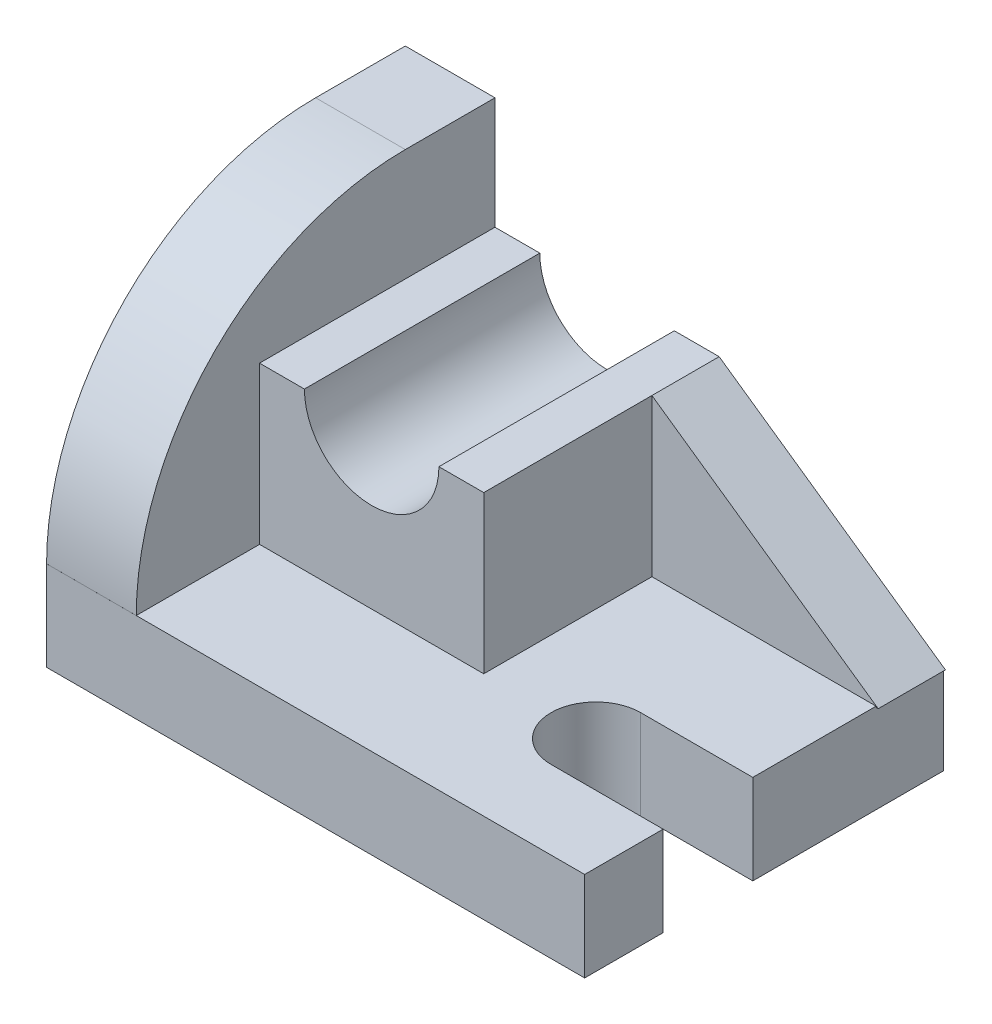
ISO-10303-21;
HEADER;
FILE_DESCRIPTION(('STEP AP214'),'2;1');
FILE_NAME('part.step','',(''),(''),'','','');
FILE_SCHEMA(('AUTOMOTIVE_DESIGN { 1 0 10303 214 1 1 1 1 }'));
ENDSEC;
DATA;
#1=APPLICATION_CONTEXT('core data for automotive mechanical design processes');
#2=APPLICATION_PROTOCOL_DEFINITION('international standard','automotive_design',2000,#1);
#3=PRODUCT_CONTEXT('',#1,'mechanical');
#4=PRODUCT('Part','Part','',(#3));
#5=PRODUCT_RELATED_PRODUCT_CATEGORY('part','',(#4));
#6=PRODUCT_DEFINITION_FORMATION('','',#4);
#7=PRODUCT_DEFINITION_CONTEXT('part definition',#1,'design');
#8=PRODUCT_DEFINITION('design','',#6,#7);
#9=PRODUCT_DEFINITION_SHAPE('','',#8);
#10=(LENGTH_UNIT() NAMED_UNIT(*) SI_UNIT(.MILLI.,.METRE.));
#11=(NAMED_UNIT(*) PLANE_ANGLE_UNIT() SI_UNIT($,.RADIAN.));
#12=(NAMED_UNIT(*) SI_UNIT($,.STERADIAN.) SOLID_ANGLE_UNIT());
#13=UNCERTAINTY_MEASURE_WITH_UNIT(LENGTH_MEASURE(1.E-05),#10,'distance_accuracy_value','');
#14=(GEOMETRIC_REPRESENTATION_CONTEXT(3) GLOBAL_UNCERTAINTY_ASSIGNED_CONTEXT((#13)) GLOBAL_UNIT_ASSIGNED_CONTEXT((#10,
#11,#12)) REPRESENTATION_CONTEXT('',''));
#15=CARTESIAN_POINT('',(0.,0.,0.));
#16=DIRECTION('',(0.,0.,1.));
#17=DIRECTION('',(1.,0.,0.));
#18=AXIS2_PLACEMENT_3D('',#15,#16,#17);
#19=CARTESIAN_POINT('',(48.,16.,-32.));
#20=DIRECTION('',(-1.,0.,0.));
#21=DIRECTION('',(0.,0.,1.));
#22=AXIS2_PLACEMENT_3D('',#19,#20,#21);
#23=PLANE('',#22);
#24=DIRECTION('',(0.,0.,-1.));
#25=VECTOR('',#24,1.);
#26=CARTESIAN_POINT('',(48.,0.,-32.));
#27=LINE('',#26,#25);
#28=CARTESIAN_POINT('',(48.,0.,32.));
#29=VERTEX_POINT('',#28);
#30=CARTESIAN_POINT('',(48.,0.,18.));
#31=VERTEX_POINT('',#30);
#32=EDGE_CURVE('E283',#29,#31,#27,.T.);
#33=ORIENTED_EDGE('',*,*,#32,.T.);
#34=DIRECTION('',(0.,1.,0.));
#35=VECTOR('',#34,1.);
#36=CARTESIAN_POINT('',(48.,0.,18.));
#37=LINE('',#36,#35);
#38=CARTESIAN_POINT('',(48.,16.,18.));
#39=VERTEX_POINT('',#38);
#40=EDGE_CURVE('E265',#31,#39,#37,.T.);
#41=ORIENTED_EDGE('',*,*,#40,.T.);
#42=DIRECTION('',(0.,0.,-1.));
#43=VECTOR('',#42,1.);
#44=CARTESIAN_POINT('',(48.,16.,-32.));
#45=LINE('',#44,#43);
#46=CARTESIAN_POINT('',(48.,16.,32.));
#47=VERTEX_POINT('',#46);
#48=EDGE_CURVE('E274',#47,#39,#45,.T.);
#49=ORIENTED_EDGE('',*,*,#48,.F.);
#50=DIRECTION('',(0.,-1.,0.));
#51=VECTOR('',#50,1.);
#52=CARTESIAN_POINT('',(48.,16.,32.));
#53=LINE('',#52,#51);
#54=EDGE_CURVE('E282',#47,#29,#53,.T.);
#55=ORIENTED_EDGE('',*,*,#54,.T.);
#56=EDGE_LOOP('',(#33,#41,#49,#55));
#57=FACE_BOUND('',#56,.T.);
#58=ADVANCED_FACE('F32',(#57),#23,.F.);
#59=DIRECTION('',(0.,-1.,0.));
#60=VECTOR('',#59,1.);
#61=CARTESIAN_POINT('',(48.,16.,-32.));
#62=LINE('',#61,#60);
#63=CARTESIAN_POINT('',(48.,15.7939448032513,-32.));
#64=VERTEX_POINT('',#63);
#65=CARTESIAN_POINT('',(48.,0.,-32.));
#66=VERTEX_POINT('',#65);
#67=EDGE_CURVE('E11',#64,#66,#62,.T.);
#68=ORIENTED_EDGE('',*,*,#67,.F.);
#69=DIRECTION('',(0.,0.,1.));
#70=VECTOR('',#69,1.);
#71=CARTESIAN_POINT('',(48.,15.7939448032513,-32.));
#72=LINE('',#71,#70);
#73=CARTESIAN_POINT('',(48.,15.7939448032513,-20.));
#74=VERTEX_POINT('',#73);
#75=EDGE_CURVE('E47',#64,#74,#72,.T.);
#76=ORIENTED_EDGE('',*,*,#75,.T.);
#77=DIRECTION('',(0.,1.,0.));
#78=VECTOR('',#77,1.);
#79=CARTESIAN_POINT('',(48.,16.,-20.));
#80=LINE('',#79,#78);
#81=CARTESIAN_POINT('',(48.,16.,-20.));
#82=VERTEX_POINT('',#81);
#83=EDGE_CURVE('E179',#74,#82,#80,.T.);
#84=ORIENTED_EDGE('',*,*,#83,.T.);
#85=CARTESIAN_POINT('',(48.,16.,1.99999999999999));
#86=VERTEX_POINT('',#85);
#87=EDGE_CURVE('E278',#86,#82,#45,.T.);
#88=ORIENTED_EDGE('',*,*,#87,.F.);
#89=DIRECTION('',(0.,1.,0.));
#90=VECTOR('',#89,1.);
#91=CARTESIAN_POINT('',(48.,0.,1.99999999999999));
#92=LINE('',#91,#90);
#93=CARTESIAN_POINT('',(48.,0.,1.99999999999999));
#94=VERTEX_POINT('',#93);
#95=EDGE_CURVE('E258',#94,#86,#92,.T.);
#96=ORIENTED_EDGE('',*,*,#95,.F.);
#97=EDGE_CURVE('E268',#94,#66,#27,.T.);
#98=ORIENTED_EDGE('',*,*,#97,.T.);
#99=EDGE_LOOP('',(#68,#76,#84,#88,#96,#98));
#100=FACE_BOUND('',#99,.T.);
#101=ADVANCED_FACE('F34',(#100),#23,.F.);
#102=CARTESIAN_POINT('',(-48.,16.,-32.));
#103=DIRECTION('',(0.,0.,1.));
#104=DIRECTION('',(1.,0.,0.));
#105=AXIS2_PLACEMENT_3D('',#102,#103,#104);
#106=PLANE('',#105);
#107=DIRECTION('',(-0.999986731906535,0.00515131156972607,0.));
#108=VECTOR('',#107,1.);
#109=CARTESIAN_POINT('',(48.3682100291097,15.7920480135015,-32.));
#110=LINE('',#109,#108);
#111=CARTESIAN_POINT('',(48.3682100291097,15.7920480135015,-32.));
#112=VERTEX_POINT('',#111);
#113=EDGE_CURVE('E162',#112,#64,#110,.T.);
#114=ORIENTED_EDGE('',*,*,#113,.T.);
#115=ORIENTED_EDGE('',*,*,#67,.T.);
#116=DIRECTION('',(-1.,0.,0.));
#117=VECTOR('',#116,1.);
#118=CARTESIAN_POINT('',(-48.,0.,-32.));
#119=LINE('',#118,#117);
#120=CARTESIAN_POINT('',(-48.,0.,-32.));
#121=VERTEX_POINT('',#120);
#122=EDGE_CURVE('E286',#66,#121,#119,.T.);
#123=ORIENTED_EDGE('',*,*,#122,.T.);
#124=DIRECTION('',(0.,-1.,0.));
#125=VECTOR('',#124,1.);
#126=CARTESIAN_POINT('',(-48.,16.,-32.));
#127=LINE('',#126,#125);
#128=CARTESIAN_POINT('',(-48.,64.,-32.));
#129=VERTEX_POINT('',#128);
#130=EDGE_CURVE('E40',#129,#121,#127,.T.);
#131=ORIENTED_EDGE('',*,*,#130,.F.);
#132=DIRECTION('',(-1.,0.,0.));
#133=VECTOR('',#132,1.);
#134=CARTESIAN_POINT('',(-32.,64.,-32.));
#135=LINE('',#134,#133);
#136=CARTESIAN_POINT('',(-32.,64.,-32.));
#137=VERTEX_POINT('',#136);
#138=EDGE_CURVE('E205',#137,#129,#135,.T.);
#139=ORIENTED_EDGE('',*,*,#138,.F.);
#140=DIRECTION('',(0.,-1.,0.));
#141=VECTOR('',#140,1.);
#142=CARTESIAN_POINT('',(-32.,0.,-32.));
#143=LINE('',#142,#141);
#144=CARTESIAN_POINT('',(-32.,44.,-32.));
#145=VERTEX_POINT('',#144);
#146=EDGE_CURVE('E190',#137,#145,#143,.T.);
#147=ORIENTED_EDGE('',*,*,#146,.T.);
#148=DIRECTION('',(1.,0.,0.));
#149=VECTOR('',#148,1.);
#150=CARTESIAN_POINT('',(0.,44.,-32.));
#151=LINE('',#150,#149);
#152=CARTESIAN_POINT('',(-24.,44.,-32.));
#153=VERTEX_POINT('',#152);
#154=EDGE_CURVE('E217',#145,#153,#151,.T.);
#155=ORIENTED_EDGE('',*,*,#154,.T.);
#156=CARTESIAN_POINT('',(-12.,44.,-32.));
#157=DIRECTION('',(0.,0.,1.));
#158=DIRECTION('',(1.,0.,0.));
#159=AXIS2_PLACEMENT_3D('',#156,#157,#158);
#160=CIRCLE('',#159,12.);
#161=CARTESIAN_POINT('',(0.,44.,-32.));
#162=VERTEX_POINT('',#161);
#163=EDGE_CURVE('E214',#153,#162,#160,.T.);
#164=ORIENTED_EDGE('',*,*,#163,.T.);
#165=CARTESIAN_POINT('',(8.,44.,-32.));
#166=VERTEX_POINT('',#165);
#167=EDGE_CURVE('E220',#162,#166,#151,.T.);
#168=ORIENTED_EDGE('',*,*,#167,.T.);
#169=DIRECTION('',(0.819706664797747,-0.572783539992338,0.));
#170=VECTOR('',#169,1.);
#171=CARTESIAN_POINT('',(8.,44.,-32.));
#172=LINE('',#171,#170);
#173=EDGE_CURVE('E183',#166,#112,#172,.T.);
#174=ORIENTED_EDGE('',*,*,#173,.T.);
#175=EDGE_LOOP('',(#114,#115,#123,#131,#139,#147,#155,#164,#168,#174));
#176=FACE_BOUND('',#175,.T.);
#177=ADVANCED_FACE('F329',(#176),#106,.F.);
#178=CARTESIAN_POINT('',(-48.,16.,-32.));
#179=DIRECTION('',(1.,0.,0.));
#180=DIRECTION('',(0.,0.,-1.));
#181=AXIS2_PLACEMENT_3D('',#178,#179,#180);
#182=PLANE('',#181);
#183=DIRECTION('',(0.,0.,1.));
#184=VECTOR('',#183,1.);
#185=CARTESIAN_POINT('',(-48.,16.,-32.));
#186=LINE('',#185,#184);
#187=CARTESIAN_POINT('',(-48.,16.,31.997051588305));
#188=VERTEX_POINT('',#187);
#189=CARTESIAN_POINT('',(-48.,16.,32.));
#190=VERTEX_POINT('',#189);
#191=EDGE_CURVE('E277',#188,#190,#186,.T.);
#192=ORIENTED_EDGE('',*,*,#191,.F.);
#193=CARTESIAN_POINT('',(-48.,16.,-16.002948411695));
#194=DIRECTION('',(-1.,0.,0.));
#195=DIRECTION('',(0.,0.,1.));
#196=AXIS2_PLACEMENT_3D('',#193,#194,#195);
#197=CIRCLE('',#196,48.);
#198=CARTESIAN_POINT('',(-48.,64.,-16.0029484116953));
#199=VERTEX_POINT('',#198);
#200=EDGE_CURVE('E189',#188,#199,#197,.T.);
#201=ORIENTED_EDGE('',*,*,#200,.T.);
#202=DIRECTION('',(0.,0.,-1.));
#203=VECTOR('',#202,1.);
#204=CARTESIAN_POINT('',(-48.,64.,-32.));
#205=LINE('',#204,#203);
#206=EDGE_CURVE('E194',#199,#129,#205,.T.);
#207=ORIENTED_EDGE('',*,*,#206,.T.);
#208=ORIENTED_EDGE('',*,*,#130,.T.);
#209=DIRECTION('',(0.,0.,1.));
#210=VECTOR('',#209,1.);
#211=CARTESIAN_POINT('',(-48.,0.,-32.));
#212=LINE('',#211,#210);
#213=CARTESIAN_POINT('',(-48.,0.,32.));
#214=VERTEX_POINT('',#213);
#215=EDGE_CURVE('E288',#121,#214,#212,.T.);
#216=ORIENTED_EDGE('',*,*,#215,.T.);
#217=DIRECTION('',(0.,-1.,0.));
#218=VECTOR('',#217,1.);
#219=CARTESIAN_POINT('',(-48.,16.,32.));
#220=LINE('',#219,#218);
#221=EDGE_CURVE('E294',#190,#214,#220,.T.);
#222=ORIENTED_EDGE('',*,*,#221,.F.);
#223=EDGE_LOOP('',(#192,#201,#207,#208,#216,#222));
#224=FACE_BOUND('',#223,.T.);
#225=ADVANCED_FACE('F300',(#224),#182,.F.);
#226=CARTESIAN_POINT('',(-48.,16.,32.));
#227=DIRECTION('',(0.,0.,-1.));
#228=DIRECTION('',(-1.,0.,0.));
#229=AXIS2_PLACEMENT_3D('',#226,#227,#228);
#230=PLANE('',#229);
#231=DIRECTION('',(1.,0.,0.));
#232=VECTOR('',#231,1.);
#233=CARTESIAN_POINT('',(-48.,0.,32.));
#234=LINE('',#233,#232);
#235=EDGE_CURVE('E290',#214,#29,#234,.T.);
#236=ORIENTED_EDGE('',*,*,#235,.T.);
#237=ORIENTED_EDGE('',*,*,#54,.F.);
#238=DIRECTION('',(1.,0.,0.));
#239=VECTOR('',#238,1.);
#240=CARTESIAN_POINT('',(-48.,16.,32.));
#241=LINE('',#240,#239);
#242=EDGE_CURVE('E280',#190,#47,#241,.T.);
#243=ORIENTED_EDGE('',*,*,#242,.F.);
#244=ORIENTED_EDGE('',*,*,#221,.T.);
#245=EDGE_LOOP('',(#236,#237,#243,#244));
#246=FACE_BOUND('',#245,.T.);
#247=ADVANCED_FACE('F312',(#246),#230,.F.);
#248=CARTESIAN_POINT('',(0.,16.,0.));
#249=DIRECTION('',(0.,1.,0.));
#250=DIRECTION('',(0.,0.,1.));
#251=AXIS2_PLACEMENT_3D('',#248,#249,#250);
#252=PLANE('',#251);
#253=DIRECTION('',(1.,0.,0.));
#254=VECTOR('',#253,1.);
#255=CARTESIAN_POINT('',(0.,16.,-20.));
#256=LINE('',#255,#254);
#257=CARTESIAN_POINT('',(8.,16.,-20.));
#258=VERTEX_POINT('',#257);
#259=EDGE_CURVE('E166',#258,#82,#256,.T.);
#260=ORIENTED_EDGE('',*,*,#259,.F.);
#261=DIRECTION('',(0.,0.,1.));
#262=VECTOR('',#261,1.);
#263=CARTESIAN_POINT('',(8.,16.,-32.));
#264=LINE('',#263,#262);
#265=CARTESIAN_POINT('',(8.,16.,9.99999999999999));
#266=VERTEX_POINT('',#265);
#267=EDGE_CURVE('E240',#258,#266,#264,.T.);
#268=ORIENTED_EDGE('',*,*,#267,.T.);
#269=DIRECTION('',(-1.,0.,0.));
#270=VECTOR('',#269,1.);
#271=CARTESIAN_POINT('',(0.,16.,9.99999999999999));
#272=LINE('',#271,#270);
#273=CARTESIAN_POINT('',(-32.,16.,9.99999999999999));
#274=VERTEX_POINT('',#273);
#275=EDGE_CURVE('E228',#266,#274,#272,.T.);
#276=ORIENTED_EDGE('',*,*,#275,.T.);
#277=DIRECTION('',(0.,0.,1.));
#278=VECTOR('',#277,1.);
#279=CARTESIAN_POINT('',(-32.,16.,0.));
#280=LINE('',#279,#278);
#281=CARTESIAN_POINT('',(-32.,16.,31.997051588305));
#282=VERTEX_POINT('',#281);
#283=EDGE_CURVE('E208',#274,#282,#280,.T.);
#284=ORIENTED_EDGE('',*,*,#283,.T.);
#285=DIRECTION('',(-1.,0.,0.));
#286=VECTOR('',#285,1.);
#287=CARTESIAN_POINT('',(-32.,15.9999999999997,31.997051588305));
#288=LINE('',#287,#286);
#289=EDGE_CURVE('E200',#282,#188,#288,.T.);
#290=ORIENTED_EDGE('',*,*,#289,.T.);
#291=ORIENTED_EDGE('',*,*,#191,.T.);
#292=ORIENTED_EDGE('',*,*,#242,.T.);
#293=ORIENTED_EDGE('',*,*,#48,.T.);
#294=DIRECTION('',(1.,0.,0.));
#295=VECTOR('',#294,1.);
#296=CARTESIAN_POINT('',(48.,16.,18.));
#297=LINE('',#296,#295);
#298=CARTESIAN_POINT('',(28.,16.,18.));
#299=VERTEX_POINT('',#298);
#300=EDGE_CURVE('E252',#299,#39,#297,.T.);
#301=ORIENTED_EDGE('',*,*,#300,.F.);
#302=CARTESIAN_POINT('',(28.,16.,9.99999999999999));
#303=DIRECTION('',(0.,1.,0.));
#304=DIRECTION('',(0.,0.,1.));
#305=AXIS2_PLACEMENT_3D('',#302,#303,#304);
#306=CIRCLE('',#305,8.);
#307=CARTESIAN_POINT('',(28.,16.,1.99999999999999));
#308=VERTEX_POINT('',#307);
#309=EDGE_CURVE('E261',#308,#299,#306,.T.);
#310=ORIENTED_EDGE('',*,*,#309,.F.);
#311=DIRECTION('',(-1.,0.,0.));
#312=VECTOR('',#311,1.);
#313=CARTESIAN_POINT('',(48.,16.,1.99999999999999));
#314=LINE('',#313,#312);
#315=EDGE_CURVE('E237',#86,#308,#314,.T.);
#316=ORIENTED_EDGE('',*,*,#315,.F.);
#317=ORIENTED_EDGE('',*,*,#87,.T.);
#318=EDGE_LOOP('',(#260,#268,#276,#284,#290,#291,#292,#293,#301,#310,#316,#317));
#319=FACE_BOUND('',#318,.T.);
#320=ADVANCED_FACE('F318',(#319),#252,.T.);
#321=CARTESIAN_POINT('',(0.,0.,0.));
#322=DIRECTION('',(0.,1.,0.));
#323=DIRECTION('',(0.,0.,1.));
#324=AXIS2_PLACEMENT_3D('',#321,#322,#323);
#325=PLANE('',#324);
#326=ORIENTED_EDGE('',*,*,#235,.F.);
#327=ORIENTED_EDGE('',*,*,#215,.F.);
#328=ORIENTED_EDGE('',*,*,#122,.F.);
#329=ORIENTED_EDGE('',*,*,#97,.F.);
#330=DIRECTION('',(-1.,0.,0.));
#331=VECTOR('',#330,1.);
#332=CARTESIAN_POINT('',(48.,0.,1.99999999999999));
#333=LINE('',#332,#331);
#334=CARTESIAN_POINT('',(28.,0.,1.99999999999999));
#335=VERTEX_POINT('',#334);
#336=EDGE_CURVE('E248',#94,#335,#333,.T.);
#337=ORIENTED_EDGE('',*,*,#336,.T.);
#338=CARTESIAN_POINT('',(28.,0.,9.99999999999999));
#339=DIRECTION('',(0.,1.,0.));
#340=DIRECTION('',(0.,0.,1.));
#341=AXIS2_PLACEMENT_3D('',#338,#339,#340);
#342=CIRCLE('',#341,8.);
#343=CARTESIAN_POINT('',(28.,0.,18.));
#344=VERTEX_POINT('',#343);
#345=EDGE_CURVE('E251',#335,#344,#342,.T.);
#346=ORIENTED_EDGE('',*,*,#345,.T.);
#347=DIRECTION('',(1.,0.,0.));
#348=VECTOR('',#347,1.);
#349=CARTESIAN_POINT('',(48.,0.,18.));
#350=LINE('',#349,#348);
#351=EDGE_CURVE('E255',#344,#31,#350,.T.);
#352=ORIENTED_EDGE('',*,*,#351,.T.);
#353=ORIENTED_EDGE('',*,*,#32,.F.);
#354=EDGE_LOOP('',(#326,#327,#328,#329,#337,#346,#352,#353));
#355=FACE_BOUND('',#354,.T.);
#356=ADVANCED_FACE('F307',(#355),#325,.F.);
#357=CARTESIAN_POINT('',(48.,0.,18.));
#358=DIRECTION('',(0.,0.,1.));
#359=DIRECTION('',(1.,0.,0.));
#360=AXIS2_PLACEMENT_3D('',#357,#358,#359);
#361=PLANE('',#360);
#362=ORIENTED_EDGE('',*,*,#300,.T.);
#363=ORIENTED_EDGE('',*,*,#40,.F.);
#364=ORIENTED_EDGE('',*,*,#351,.F.);
#365=DIRECTION('',(0.,1.,0.));
#366=VECTOR('',#365,1.);
#367=CARTESIAN_POINT('',(28.,0.,18.));
#368=LINE('',#367,#366);
#369=EDGE_CURVE('E269',#344,#299,#368,.T.);
#370=ORIENTED_EDGE('',*,*,#369,.T.);
#371=EDGE_LOOP('',(#362,#363,#364,#370));
#372=FACE_BOUND('',#371,.T.);
#373=ADVANCED_FACE('F363',(#372),#361,.F.);
#374=CARTESIAN_POINT('',(28.,0.,9.99999999999999));
#375=DIRECTION('',(0.,1.,0.));
#376=DIRECTION('',(0.,0.,1.));
#377=AXIS2_PLACEMENT_3D('',#374,#375,#376);
#378=CYLINDRICAL_SURFACE('',#377,8.);
#379=ORIENTED_EDGE('',*,*,#309,.T.);
#380=ORIENTED_EDGE('',*,*,#369,.F.);
#381=ORIENTED_EDGE('',*,*,#345,.F.);
#382=DIRECTION('',(0.,1.,0.));
#383=VECTOR('',#382,1.);
#384=CARTESIAN_POINT('',(28.,0.,1.99999999999999));
#385=LINE('',#384,#383);
#386=EDGE_CURVE('E271',#335,#308,#385,.T.);
#387=ORIENTED_EDGE('',*,*,#386,.T.);
#388=EDGE_LOOP('',(#379,#380,#381,#387));
#389=FACE_BOUND('',#388,.T.);
#390=ADVANCED_FACE('F360',(#389),#378,.F.);
#391=CARTESIAN_POINT('',(48.,0.,1.99999999999999));
#392=DIRECTION('',(0.,0.,-1.));
#393=DIRECTION('',(-1.,0.,0.));
#394=AXIS2_PLACEMENT_3D('',#391,#392,#393);
#395=PLANE('',#394);
#396=ORIENTED_EDGE('',*,*,#315,.T.);
#397=ORIENTED_EDGE('',*,*,#386,.F.);
#398=ORIENTED_EDGE('',*,*,#336,.F.);
#399=ORIENTED_EDGE('',*,*,#95,.T.);
#400=EDGE_LOOP('',(#396,#397,#398,#399));
#401=FACE_BOUND('',#400,.T.);
#402=ADVANCED_FACE('F358',(#401),#395,.F.);
#403=CARTESIAN_POINT('',(-12.,44.,-32.));
#404=DIRECTION('',(0.,0.,1.));
#405=DIRECTION('',(1.,0.,0.));
#406=AXIS2_PLACEMENT_3D('',#403,#404,#405);
#407=CYLINDRICAL_SURFACE('',#406,12.);
#408=CARTESIAN_POINT('',(-12.,44.,9.99999999999999));
#409=DIRECTION('',(0.,0.,1.));
#410=DIRECTION('',(1.,0.,0.));
#411=AXIS2_PLACEMENT_3D('',#408,#409,#410);
#412=CIRCLE('',#411,12.);
#413=CARTESIAN_POINT('',(-24.,44.,9.99999999999999));
#414=VERTEX_POINT('',#413);
#415=CARTESIAN_POINT('',(0.,44.,9.99999999999999));
#416=VERTEX_POINT('',#415);
#417=EDGE_CURVE('E213',#414,#416,#412,.T.);
#418=ORIENTED_EDGE('',*,*,#417,.T.);
#419=DIRECTION('',(0.,0.,1.));
#420=VECTOR('',#419,1.);
#421=CARTESIAN_POINT('',(0.,44.,-32.));
#422=LINE('',#421,#420);
#423=EDGE_CURVE('E234',#162,#416,#422,.T.);
#424=ORIENTED_EDGE('',*,*,#423,.F.);
#425=ORIENTED_EDGE('',*,*,#163,.F.);
#426=DIRECTION('',(0.,0.,1.));
#427=VECTOR('',#426,1.);
#428=CARTESIAN_POINT('',(-24.,44.,-32.));
#429=LINE('',#428,#427);
#430=EDGE_CURVE('E245',#153,#414,#429,.T.);
#431=ORIENTED_EDGE('',*,*,#430,.T.);
#432=EDGE_LOOP('',(#418,#424,#425,#431));
#433=FACE_BOUND('',#432,.T.);
#434=ADVANCED_FACE('F341',(#433),#407,.F.);
#435=CARTESIAN_POINT('',(0.,44.,-32.));
#436=DIRECTION('',(0.,-1.,0.));
#437=DIRECTION('',(0.,0.,-1.));
#438=AXIS2_PLACEMENT_3D('',#435,#436,#437);
#439=PLANE('',#438);
#440=DIRECTION('',(1.,0.,0.));
#441=VECTOR('',#440,1.);
#442=CARTESIAN_POINT('',(0.,44.,9.99999999999999));
#443=LINE('',#442,#441);
#444=CARTESIAN_POINT('',(8.,44.,9.99999999999999));
#445=VERTEX_POINT('',#444);
#446=EDGE_CURVE('E218',#416,#445,#443,.T.);
#447=ORIENTED_EDGE('',*,*,#446,.T.);
#448=DIRECTION('',(0.,0.,1.));
#449=VECTOR('',#448,1.);
#450=CARTESIAN_POINT('',(8.,44.,-32.));
#451=LINE('',#450,#449);
#452=CARTESIAN_POINT('',(8.,44.,-20.));
#453=VERTEX_POINT('',#452);
#454=EDGE_CURVE('E239',#453,#445,#451,.T.);
#455=ORIENTED_EDGE('',*,*,#454,.F.);
#456=EDGE_CURVE('E172',#166,#453,#451,.T.);
#457=ORIENTED_EDGE('',*,*,#456,.F.);
#458=ORIENTED_EDGE('',*,*,#167,.F.);
#459=ORIENTED_EDGE('',*,*,#423,.T.);
#460=EDGE_LOOP('',(#447,#455,#457,#458,#459));
#461=FACE_BOUND('',#460,.T.);
#462=ADVANCED_FACE('F345',(#461),#439,.F.);
#463=CARTESIAN_POINT('',(8.,0.,-32.));
#464=DIRECTION('',(1.,0.,0.));
#465=DIRECTION('',(0.,0.,-1.));
#466=AXIS2_PLACEMENT_3D('',#463,#464,#465);
#467=PLANE('',#466);
#468=DIRECTION('',(0.,1.,0.));
#469=VECTOR('',#468,1.);
#470=CARTESIAN_POINT('',(8.,16.,-20.));
#471=LINE('',#470,#469);
#472=EDGE_CURVE('E175',#258,#453,#471,.T.);
#473=ORIENTED_EDGE('',*,*,#472,.T.);
#474=ORIENTED_EDGE('',*,*,#454,.T.);
#475=DIRECTION('',(0.,1.,0.));
#476=VECTOR('',#475,1.);
#477=CARTESIAN_POINT('',(8.,0.,9.99999999999999));
#478=LINE('',#477,#476);
#479=EDGE_CURVE('E231',#266,#445,#478,.T.);
#480=ORIENTED_EDGE('',*,*,#479,.F.);
#481=ORIENTED_EDGE('',*,*,#267,.F.);
#482=EDGE_LOOP('',(#473,#474,#480,#481));
#483=FACE_BOUND('',#482,.T.);
#484=ADVANCED_FACE('F349',(#483),#467,.T.);
#485=CARTESIAN_POINT('',(-32.,44.,9.99999999999999));
#486=VERTEX_POINT('',#485);
#487=EDGE_CURVE('E223',#486,#414,#443,.T.);
#488=ORIENTED_EDGE('',*,*,#487,.T.);
#489=ORIENTED_EDGE('',*,*,#430,.F.);
#490=ORIENTED_EDGE('',*,*,#154,.F.);
#491=DIRECTION('',(0.,0.,1.));
#492=VECTOR('',#491,1.);
#493=CARTESIAN_POINT('',(-32.,44.,-32.));
#494=LINE('',#493,#492);
#495=EDGE_CURVE('E242',#145,#486,#494,.T.);
#496=ORIENTED_EDGE('',*,*,#495,.T.);
#497=EDGE_LOOP('',(#488,#489,#490,#496));
#498=FACE_BOUND('',#497,.T.);
#499=ADVANCED_FACE('F335',(#498),#439,.F.);
#500=CARTESIAN_POINT('',(0.,0.,9.99999999999999));
#501=DIRECTION('',(0.,0.,1.));
#502=DIRECTION('',(1.,0.,0.));
#503=AXIS2_PLACEMENT_3D('',#500,#501,#502);
#504=PLANE('',#503);
#505=ORIENTED_EDGE('',*,*,#417,.F.);
#506=ORIENTED_EDGE('',*,*,#487,.F.);
#507=DIRECTION('',(0.,1.,0.));
#508=VECTOR('',#507,1.);
#509=CARTESIAN_POINT('',(-32.,0.,9.99999999999999));
#510=LINE('',#509,#508);
#511=EDGE_CURVE('E225',#274,#486,#510,.T.);
#512=ORIENTED_EDGE('',*,*,#511,.F.);
#513=ORIENTED_EDGE('',*,*,#275,.F.);
#514=ORIENTED_EDGE('',*,*,#479,.T.);
#515=ORIENTED_EDGE('',*,*,#446,.F.);
#516=EDGE_LOOP('',(#505,#506,#512,#513,#514,#515));
#517=FACE_BOUND('',#516,.T.);
#518=ADVANCED_FACE('F400',(#517),#504,.T.);
#519=CARTESIAN_POINT('',(-32.,64.,-32.));
#520=DIRECTION('',(0.,1.,0.));
#521=DIRECTION('',(0.,0.,1.));
#522=AXIS2_PLACEMENT_3D('',#519,#520,#521);
#523=PLANE('',#522);
#524=ORIENTED_EDGE('',*,*,#206,.F.);
#525=DIRECTION('',(-1.,0.,0.));
#526=VECTOR('',#525,1.);
#527=CARTESIAN_POINT('',(-32.,64.,-16.0029484116953));
#528=LINE('',#527,#526);
#529=CARTESIAN_POINT('',(-32.,64.,-16.0029484116953));
#530=VERTEX_POINT('',#529);
#531=EDGE_CURVE('E209',#530,#199,#528,.T.);
#532=ORIENTED_EDGE('',*,*,#531,.F.);
#533=DIRECTION('',(0.,0.,-1.));
#534=VECTOR('',#533,1.);
#535=CARTESIAN_POINT('',(-32.,64.,-32.));
#536=LINE('',#535,#534);
#537=EDGE_CURVE('E197',#530,#137,#536,.T.);
#538=ORIENTED_EDGE('',*,*,#537,.T.);
#539=ORIENTED_EDGE('',*,*,#138,.T.);
#540=EDGE_LOOP('',(#524,#532,#538,#539));
#541=FACE_BOUND('',#540,.T.);
#542=ADVANCED_FACE('F327',(#541),#523,.T.);
#543=CARTESIAN_POINT('',(-32.,16.,-16.002948411695));
#544=DIRECTION('',(-1.,0.,0.));
#545=DIRECTION('',(0.,0.,1.));
#546=AXIS2_PLACEMENT_3D('',#543,#544,#545);
#547=CYLINDRICAL_SURFACE('',#546,48.);
#548=ORIENTED_EDGE('',*,*,#200,.F.);
#549=ORIENTED_EDGE('',*,*,#289,.F.);
#550=CARTESIAN_POINT('',(-32.,16.,-16.002948411695));
#551=DIRECTION('',(-1.,0.,0.));
#552=DIRECTION('',(0.,0.,1.));
#553=AXIS2_PLACEMENT_3D('',#550,#551,#552);
#554=CIRCLE('',#553,48.);
#555=EDGE_CURVE('E193',#282,#530,#554,.T.);
#556=ORIENTED_EDGE('',*,*,#555,.T.);
#557=ORIENTED_EDGE('',*,*,#531,.T.);
#558=EDGE_LOOP('',(#548,#549,#556,#557));
#559=FACE_BOUND('',#558,.T.);
#560=ADVANCED_FACE('F323',(#559),#547,.T.);
#561=CARTESIAN_POINT('',(-32.,16.,-16.002948411695));
#562=DIRECTION('',(-1.,0.,0.));
#563=DIRECTION('',(0.,0.,1.));
#564=AXIS2_PLACEMENT_3D('',#561,#562,#563);
#565=PLANE('',#564);
#566=ORIENTED_EDGE('',*,*,#283,.F.);
#567=ORIENTED_EDGE('',*,*,#511,.T.);
#568=ORIENTED_EDGE('',*,*,#495,.F.);
#569=ORIENTED_EDGE('',*,*,#146,.F.);
#570=ORIENTED_EDGE('',*,*,#537,.F.);
#571=ORIENTED_EDGE('',*,*,#555,.F.);
#572=EDGE_LOOP('',(#566,#567,#568,#569,#570,#571));
#573=FACE_BOUND('',#572,.T.);
#574=ADVANCED_FACE('F333',(#573),#565,.F.);
#575=CARTESIAN_POINT('',(48.3682100291097,15.7920480135015,-20.));
#576=DIRECTION('',(-0.00515131156972607,-0.999986731906535,0.));
#577=DIRECTION('',(0.999986731906535,-0.00515131156972607,0.));
#578=AXIS2_PLACEMENT_3D('',#575,#576,#577);
#579=PLANE('',#578);
#580=ORIENTED_EDGE('',*,*,#75,.F.);
#581=ORIENTED_EDGE('',*,*,#113,.F.);
#582=DIRECTION('',(0.,0.,-1.));
#583=VECTOR('',#582,1.);
#584=CARTESIAN_POINT('',(48.3682100291097,15.7920480135015,-20.));
#585=LINE('',#584,#583);
#586=CARTESIAN_POINT('',(48.3682100291097,15.7920480135015,-20.));
#587=VERTEX_POINT('',#586);
#588=EDGE_CURVE('E156',#587,#112,#585,.T.);
#589=ORIENTED_EDGE('',*,*,#588,.F.);
#590=DIRECTION('',(-0.999986731906535,0.00515131156972607,0.));
#591=VECTOR('',#590,1.);
#592=CARTESIAN_POINT('',(48.3682100291097,15.7920480135015,-20.));
#593=LINE('',#592,#591);
#594=EDGE_CURVE('E160',#587,#74,#593,.T.);
#595=ORIENTED_EDGE('',*,*,#594,.T.);
#596=EDGE_LOOP('',(#580,#581,#589,#595));
#597=FACE_BOUND('',#596,.T.);
#598=ADVANCED_FACE('F158',(#597),#579,.T.);
#599=CARTESIAN_POINT('',(0.,0.,-20.));
#600=DIRECTION('',(0.,0.,1.));
#601=DIRECTION('',(1.,0.,0.));
#602=AXIS2_PLACEMENT_3D('',#599,#600,#601);
#603=PLANE('',#602);
#604=ORIENTED_EDGE('',*,*,#83,.F.);
#605=ORIENTED_EDGE('',*,*,#594,.F.);
#606=DIRECTION('',(0.819706664797747,-0.572783539992338,0.));
#607=VECTOR('',#606,1.);
#608=CARTESIAN_POINT('',(8.,44.,-20.));
#609=LINE('',#608,#607);
#610=EDGE_CURVE('E170',#453,#587,#609,.T.);
#611=ORIENTED_EDGE('',*,*,#610,.F.);
#612=ORIENTED_EDGE('',*,*,#472,.F.);
#613=ORIENTED_EDGE('',*,*,#259,.T.);
#614=EDGE_LOOP('',(#604,#605,#611,#612,#613));
#615=FACE_BOUND('',#614,.T.);
#616=ADVANCED_FACE('F177',(#615),#603,.T.);
#617=CARTESIAN_POINT('',(8.,44.,-20.));
#618=DIRECTION('',(0.572783539992338,0.819706664797747,0.));
#619=DIRECTION('',(-0.819706664797747,0.572783539992338,0.));
#620=AXIS2_PLACEMENT_3D('',#617,#618,#619);
#621=PLANE('',#620);
#622=ORIENTED_EDGE('',*,*,#173,.F.);
#623=ORIENTED_EDGE('',*,*,#456,.T.);
#624=ORIENTED_EDGE('',*,*,#610,.T.);
#625=ORIENTED_EDGE('',*,*,#588,.T.);
#626=EDGE_LOOP('',(#622,#623,#624,#625));
#627=FACE_BOUND('',#626,.T.);
#628=ADVANCED_FACE('F171',(#627),#621,.T.);
#629=CLOSED_SHELL('',(#58,#101,#177,#225,#247,#320,#356,#373,#390,#402,#434,#462,#484,#499,#518,
#542,#560,#574,#598,#616,#628));
#630=MANIFOLD_SOLID_BREP('B2',#629);
#631=ADVANCED_BREP_SHAPE_REPRESENTATION('',(#18,#630),#14);
#632=SHAPE_DEFINITION_REPRESENTATION(#9,#631);
ENDSEC;
END-ISO-10303-21;
